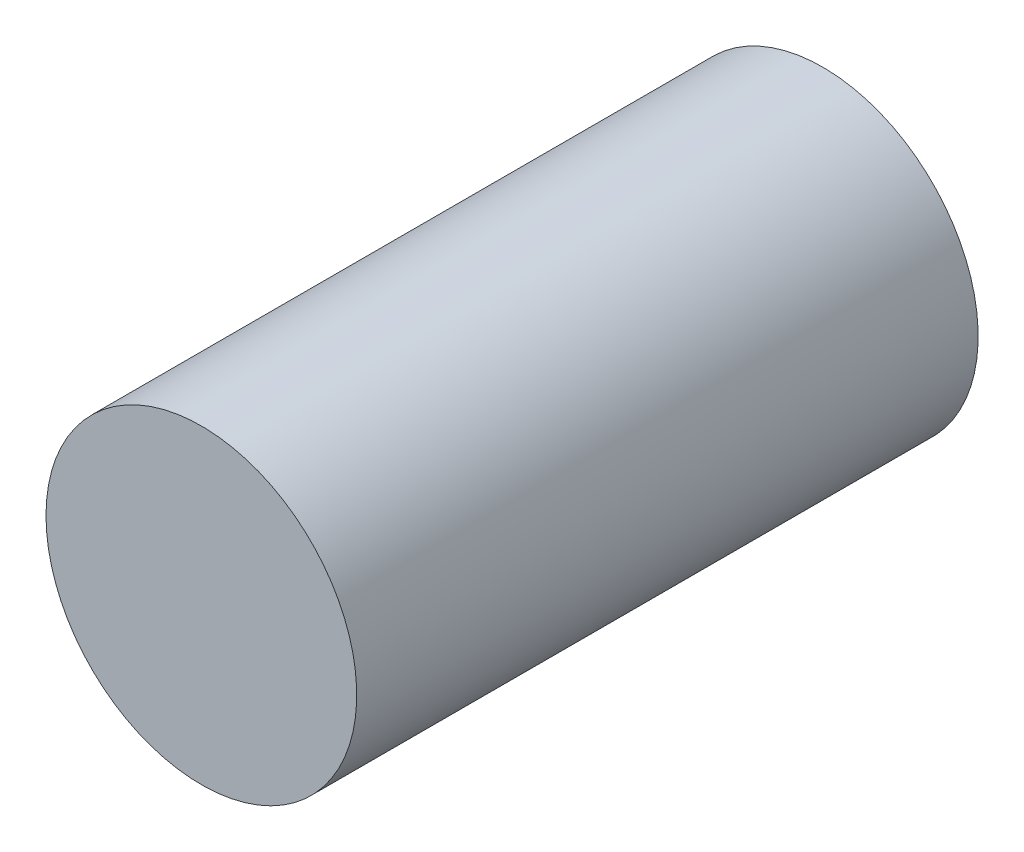
ISO-10303-21;
HEADER;
FILE_DESCRIPTION(('STEP AP214'),'2;1');
FILE_NAME('part.step','',(''),(''),'','','');
FILE_SCHEMA(('AUTOMOTIVE_DESIGN { 1 0 10303 214 1 1 1 1 }'));
ENDSEC;
DATA;
#1=APPLICATION_CONTEXT('core data for automotive mechanical design processes');
#2=APPLICATION_PROTOCOL_DEFINITION('international standard','automotive_design',2000,#1);
#3=PRODUCT_CONTEXT('',#1,'mechanical');
#4=PRODUCT('Part','Part','',(#3));
#5=PRODUCT_RELATED_PRODUCT_CATEGORY('part','',(#4));
#6=PRODUCT_DEFINITION_FORMATION('','',#4);
#7=PRODUCT_DEFINITION_CONTEXT('part definition',#1,'design');
#8=PRODUCT_DEFINITION('design','',#6,#7);
#9=PRODUCT_DEFINITION_SHAPE('','',#8);
#10=(LENGTH_UNIT() NAMED_UNIT(*) SI_UNIT(.MILLI.,.METRE.));
#11=(NAMED_UNIT(*) PLANE_ANGLE_UNIT() SI_UNIT($,.RADIAN.));
#12=(NAMED_UNIT(*) SI_UNIT($,.STERADIAN.) SOLID_ANGLE_UNIT());
#13=UNCERTAINTY_MEASURE_WITH_UNIT(LENGTH_MEASURE(1.E-05),#10,'distance_accuracy_value','');
#14=(GEOMETRIC_REPRESENTATION_CONTEXT(3) GLOBAL_UNCERTAINTY_ASSIGNED_CONTEXT((#13)) GLOBAL_UNIT_ASSIGNED_CONTEXT((#10,
#11,#12)) REPRESENTATION_CONTEXT('',''));
#15=CARTESIAN_POINT('',(0.,0.,0.));
#16=DIRECTION('',(0.,0.,1.));
#17=DIRECTION('',(1.,0.,0.));
#18=AXIS2_PLACEMENT_3D('',#15,#16,#17);
#19=CARTESIAN_POINT('',(0.,0.,152.4));
#20=DIRECTION('',(0.,0.,-1.));
#21=DIRECTION('',(-1.,0.,0.));
#22=AXIS2_PLACEMENT_3D('',#19,#20,#21);
#23=CYLINDRICAL_SURFACE('',#22,38.1);
#24=CARTESIAN_POINT('',(0.,0.,152.4));
#25=DIRECTION('',(0.,0.,1.));
#26=DIRECTION('',(1.,0.,0.));
#27=AXIS2_PLACEMENT_3D('',#24,#25,#26);
#28=CIRCLE('',#27,38.1);
#29=CARTESIAN_POINT('',(-38.1,0.,152.4));
#30=VERTEX_POINT('',#29);
#31=EDGE_CURVE('E10',#30,#30,#28,.T.);
#32=CARTESIAN_POINT('',(0.,0.,0.));
#33=DIRECTION('',(0.,0.,1.));
#34=DIRECTION('',(1.,0.,0.));
#35=AXIS2_PLACEMENT_3D('',#32,#33,#34);
#36=CIRCLE('',#35,38.1);
#37=CARTESIAN_POINT('',(-38.1,0.,0.));
#38=VERTEX_POINT('',#37);
#39=EDGE_CURVE('E34',#38,#38,#36,.T.);
#40=CARTESIAN_POINT('',(-38.1,0.,152.4));
#41=CARTESIAN_POINT('',(-38.1,0.,150.8125));
#42=CARTESIAN_POINT('',(-38.1,0.,149.225));
#43=CARTESIAN_POINT('',(-38.1,0.,146.05));
#44=CARTESIAN_POINT('',(-38.1,0.,144.4625));
#45=CARTESIAN_POINT('',(-38.1,0.,141.2875));
#46=CARTESIAN_POINT('',(-38.1,0.,139.7));
#47=CARTESIAN_POINT('',(-38.1,0.,136.525));
#48=CARTESIAN_POINT('',(-38.1,0.,134.9375));
#49=CARTESIAN_POINT('',(-38.1,0.,131.7625));
#50=CARTESIAN_POINT('',(-38.1,0.,130.175));
#51=CARTESIAN_POINT('',(-38.1,0.,127.));
#52=CARTESIAN_POINT('',(-38.1,0.,125.4125));
#53=CARTESIAN_POINT('',(-38.1,0.,122.2375));
#54=CARTESIAN_POINT('',(-38.1,0.,120.65));
#55=CARTESIAN_POINT('',(-38.1,0.,117.475));
#56=CARTESIAN_POINT('',(-38.1,0.,115.8875));
#57=CARTESIAN_POINT('',(-38.1,0.,112.7125));
#58=CARTESIAN_POINT('',(-38.1,0.,111.125));
#59=CARTESIAN_POINT('',(-38.1,0.,107.95));
#60=CARTESIAN_POINT('',(-38.1,0.,106.3625));
#61=CARTESIAN_POINT('',(-38.1,0.,103.1875));
#62=CARTESIAN_POINT('',(-38.1,0.,101.6));
#63=CARTESIAN_POINT('',(-38.1,0.,98.425));
#64=CARTESIAN_POINT('',(-38.1,0.,96.8375));
#65=CARTESIAN_POINT('',(-38.1,0.,93.6625));
#66=CARTESIAN_POINT('',(-38.1,0.,92.075));
#67=CARTESIAN_POINT('',(-38.1,0.,88.9));
#68=CARTESIAN_POINT('',(-38.1,0.,87.3125));
#69=CARTESIAN_POINT('',(-38.1,0.,84.1375));
#70=CARTESIAN_POINT('',(-38.1,0.,82.55));
#71=CARTESIAN_POINT('',(-38.1,0.,79.375));
#72=CARTESIAN_POINT('',(-38.1,0.,77.7875));
#73=CARTESIAN_POINT('',(-38.1,0.,74.6125));
#74=CARTESIAN_POINT('',(-38.1,0.,73.025));
#75=CARTESIAN_POINT('',(-38.1,0.,69.85));
#76=CARTESIAN_POINT('',(-38.1,0.,68.2625));
#77=CARTESIAN_POINT('',(-38.1,0.,65.0875));
#78=CARTESIAN_POINT('',(-38.1,0.,63.5));
#79=CARTESIAN_POINT('',(-38.1,0.,60.325));
#80=CARTESIAN_POINT('',(-38.1,0.,58.7375));
#81=CARTESIAN_POINT('',(-38.1,0.,55.5625));
#82=CARTESIAN_POINT('',(-38.1,0.,53.975));
#83=CARTESIAN_POINT('',(-38.1,0.,50.8));
#84=CARTESIAN_POINT('',(-38.1,0.,49.2125));
#85=CARTESIAN_POINT('',(-38.1,0.,46.0375));
#86=CARTESIAN_POINT('',(-38.1,0.,44.45));
#87=CARTESIAN_POINT('',(-38.1,0.,41.275));
#88=CARTESIAN_POINT('',(-38.1,0.,39.6875));
#89=CARTESIAN_POINT('',(-38.1,0.,36.5125));
#90=CARTESIAN_POINT('',(-38.1,0.,34.925));
#91=CARTESIAN_POINT('',(-38.1,0.,31.75));
#92=CARTESIAN_POINT('',(-38.1,0.,30.1625));
#93=CARTESIAN_POINT('',(-38.1,0.,26.9875));
#94=CARTESIAN_POINT('',(-38.1,0.,25.4));
#95=CARTESIAN_POINT('',(-38.1,0.,22.225));
#96=CARTESIAN_POINT('',(-38.1,0.,20.6375));
#97=CARTESIAN_POINT('',(-38.1,0.,17.4625));
#98=CARTESIAN_POINT('',(-38.1,0.,15.875));
#99=CARTESIAN_POINT('',(-38.1,0.,12.7));
#100=CARTESIAN_POINT('',(-38.1,0.,11.1125));
#101=CARTESIAN_POINT('',(-38.1,0.,7.93750000000001));
#102=CARTESIAN_POINT('',(-38.1,0.,6.35));
#103=CARTESIAN_POINT('',(-38.1,0.,3.175));
#104=CARTESIAN_POINT('',(-38.1,0.,1.5875));
#105=CARTESIAN_POINT('',(-38.1,0.,0.));
#106=B_SPLINE_CURVE_WITH_KNOTS('',3,(#40,#41,#42,#43,#44,#45,#46,#47,#48,#49,#50,#51,#52,#53,
#54,#55,#56,#57,#58,#59,#60,#61,#62,#63,#64,#65,#66,#67,#68,#69,#70,#71,#72,#73,#74,#75,#76,#77,
#78,#79,#80,#81,#82,#83,#84,#85,#86,#87,#88,#89,#90,#91,#92,#93,#94,#95,#96,#97,#98,#99,#100,
#101,#102,#103,#104,#105),.UNSPECIFIED.,.F.,.F.,(4,2,2,2,2,2,2,2,2,2,2,2,2,2,2,2,2,2,2,2,2,2,2,
2,2,2,2,2,2,2,2,2,4),(0.,4.7625,9.52500000000001,14.2875,19.05,23.8125,28.575,33.3375,38.1,
42.8625,47.625,52.3875,57.15,61.9125,66.675,71.4375,76.2,80.9625,85.725,90.4875,95.25,100.0125,
104.775,109.5375,114.3,119.0625,123.825,128.5875,133.35,138.1125,142.875,147.6375,152.4),.UNSPECIFIED.);
#107=EDGE_CURVE('BSEAM31',#30,#38,#106,.T.);
#108=ORIENTED_EDGE('',*,*,#31,.F.);
#109=ORIENTED_EDGE('',*,*,#39,.T.);
#110=ORIENTED_EDGE('',*,*,#107,.T.);
#111=ORIENTED_EDGE('',*,*,#107,.F.);
#112=EDGE_LOOP('',(#108,#110,#109,#111));
#113=FACE_BOUND('',#112,.T.);
#114=ADVANCED_FACE('F31',(#113),#23,.T.);
#115=CARTESIAN_POINT('',(0.,0.,152.4));
#116=DIRECTION('',(0.,0.,1.));
#117=DIRECTION('',(1.,0.,0.));
#118=AXIS2_PLACEMENT_3D('',#115,#116,#117);
#119=PLANE('',#118);
#120=ORIENTED_EDGE('',*,*,#31,.T.);
#121=EDGE_LOOP('',(#120));
#122=FACE_BOUND('',#121,.T.);
#123=ADVANCED_FACE('F46',(#122),#119,.T.);
#124=CARTESIAN_POINT('',(0.,0.,0.));
#125=DIRECTION('',(0.,0.,1.));
#126=DIRECTION('',(1.,0.,0.));
#127=AXIS2_PLACEMENT_3D('',#124,#125,#126);
#128=PLANE('',#127);
#129=ORIENTED_EDGE('',*,*,#39,.F.);
#130=EDGE_LOOP('',(#129));
#131=FACE_BOUND('',#130,.T.);
#132=ADVANCED_FACE('F44',(#131),#128,.F.);
#133=CLOSED_SHELL('',(#114,#123,#132));
#134=MANIFOLD_SOLID_BREP('B2',#133);
#135=ADVANCED_BREP_SHAPE_REPRESENTATION('',(#18,#134),#14);
#136=SHAPE_DEFINITION_REPRESENTATION(#9,#135);
ENDSEC;
END-ISO-10303-21;
